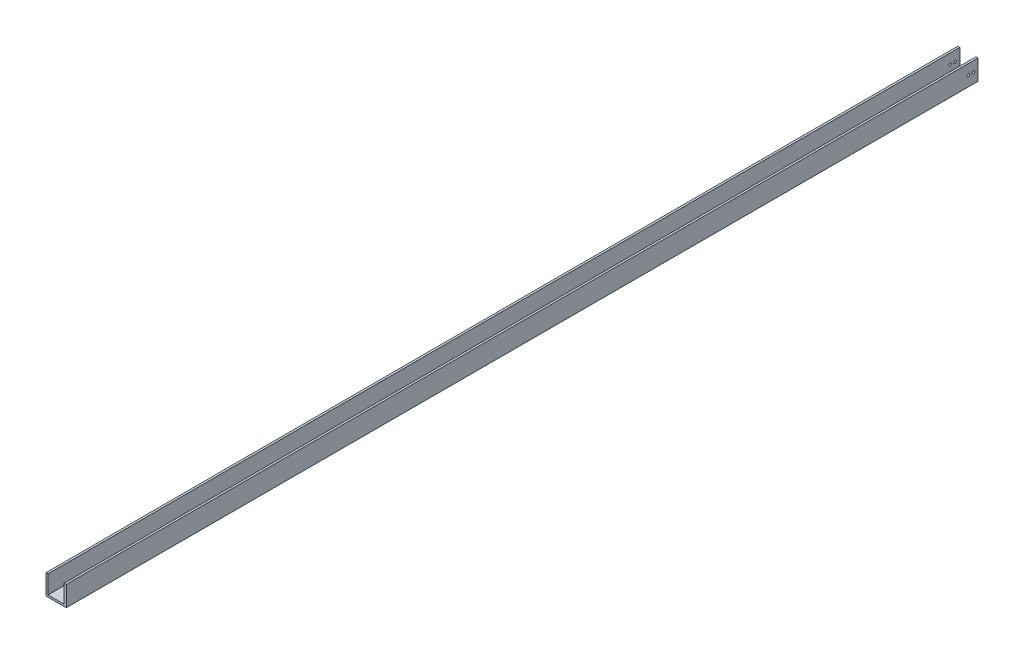
ISO-10303-21;
HEADER;
FILE_DESCRIPTION(('STEP AP214'),'2;1');
FILE_NAME('part.step','',(''),(''),'','','');
FILE_SCHEMA(('AUTOMOTIVE_DESIGN { 1 0 10303 214 1 1 1 1 }'));
ENDSEC;
DATA;
#1=APPLICATION_CONTEXT('core data for automotive mechanical design processes');
#2=APPLICATION_PROTOCOL_DEFINITION('international standard','automotive_design',2000,#1);
#3=PRODUCT_CONTEXT('',#1,'mechanical');
#4=PRODUCT('Part','Part','',(#3));
#5=PRODUCT_RELATED_PRODUCT_CATEGORY('part','',(#4));
#6=PRODUCT_DEFINITION_FORMATION('','',#4);
#7=PRODUCT_DEFINITION_CONTEXT('part definition',#1,'design');
#8=PRODUCT_DEFINITION('design','',#6,#7);
#9=PRODUCT_DEFINITION_SHAPE('','',#8);
#10=(LENGTH_UNIT() NAMED_UNIT(*) SI_UNIT(.MILLI.,.METRE.));
#11=(NAMED_UNIT(*) PLANE_ANGLE_UNIT() SI_UNIT($,.RADIAN.));
#12=(NAMED_UNIT(*) SI_UNIT($,.STERADIAN.) SOLID_ANGLE_UNIT());
#13=UNCERTAINTY_MEASURE_WITH_UNIT(LENGTH_MEASURE(1.E-05),#10,'distance_accuracy_value','');
#14=(GEOMETRIC_REPRESENTATION_CONTEXT(3) GLOBAL_UNCERTAINTY_ASSIGNED_CONTEXT((#13)) GLOBAL_UNIT_ASSIGNED_CONTEXT((#10,
#11,#12)) REPRESENTATION_CONTEXT('',''));
#15=CARTESIAN_POINT('',(0.,0.,0.));
#16=DIRECTION('',(0.,0.,1.));
#17=DIRECTION('',(1.,0.,0.));
#18=AXIS2_PLACEMENT_3D('',#15,#16,#17);
#19=CARTESIAN_POINT('',(0.,-40.,1800.));
#20=DIRECTION('',(1.,0.,0.));
#21=DIRECTION('',(0.,0.,-1.));
#22=AXIS2_PLACEMENT_3D('',#19,#20,#21);
#23=PLANE('',#22);
#24=CARTESIAN_POINT('',(0.,-20.,9.));
#25=DIRECTION('',(-1.,0.,0.));
#26=DIRECTION('',(0.,0.,1.));
#27=AXIS2_PLACEMENT_3D('',#24,#25,#26);
#28=CIRCLE('',#27,2.5);
#29=CARTESIAN_POINT('',(0.,-20.,11.5));
#30=VERTEX_POINT('',#29);
#31=EDGE_CURVE('E193',#30,#30,#28,.T.);
#32=ORIENTED_EDGE('',*,*,#31,.F.);
#33=EDGE_LOOP('',(#32));
#34=FACE_BOUND('',#33,.T.);
#35=CARTESIAN_POINT('',(0.,-20.,19.));
#36=DIRECTION('',(-1.,0.,0.));
#37=DIRECTION('',(0.,0.,1.));
#38=AXIS2_PLACEMENT_3D('',#35,#36,#37);
#39=CIRCLE('',#38,2.5);
#40=CARTESIAN_POINT('',(0.,-20.,21.5));
#41=VERTEX_POINT('',#40);
#42=EDGE_CURVE('E181',#41,#41,#39,.T.);
#43=ORIENTED_EDGE('',*,*,#42,.F.);
#44=EDGE_LOOP('',(#43));
#45=FACE_BOUND('',#44,.T.);
#46=DIRECTION('',(0.,-1.,0.));
#47=VECTOR('',#46,1.);
#48=CARTESIAN_POINT('',(0.,-40.,0.));
#49=LINE('',#48,#47);
#50=CARTESIAN_POINT('',(0.,0.,0.));
#51=VERTEX_POINT('',#50);
#52=CARTESIAN_POINT('',(0.,-40.,0.));
#53=VERTEX_POINT('',#52);
#54=EDGE_CURVE('E141',#51,#53,#49,.T.);
#55=ORIENTED_EDGE('',*,*,#54,.T.);
#56=DIRECTION('',(0.,0.,-1.));
#57=VECTOR('',#56,1.);
#58=CARTESIAN_POINT('',(0.,-40.,1800.));
#59=LINE('',#58,#57);
#60=CARTESIAN_POINT('',(0.,-40.,1800.));
#61=VERTEX_POINT('',#60);
#62=EDGE_CURVE('E11',#61,#53,#59,.T.);
#63=ORIENTED_EDGE('',*,*,#62,.F.);
#64=DIRECTION('',(0.,-1.,0.));
#65=VECTOR('',#64,1.);
#66=CARTESIAN_POINT('',(0.,-40.,1800.));
#67=LINE('',#66,#65);
#68=CARTESIAN_POINT('',(0.,0.,1800.));
#69=VERTEX_POINT('',#68);
#70=EDGE_CURVE('E156',#69,#61,#67,.T.);
#71=ORIENTED_EDGE('',*,*,#70,.F.);
#72=DIRECTION('',(0.,0.,-1.));
#73=VECTOR('',#72,1.);
#74=CARTESIAN_POINT('',(0.,0.,1800.));
#75=LINE('',#74,#73);
#76=EDGE_CURVE('E137',#69,#51,#75,.T.);
#77=ORIENTED_EDGE('',*,*,#76,.T.);
#78=EDGE_LOOP('',(#55,#63,#71,#77));
#79=FACE_BOUND('',#78,.T.);
#80=ADVANCED_FACE('F43',(#34,#45,#79),#23,.F.);
#81=CARTESIAN_POINT('',(40.,-40.,1800.));
#82=DIRECTION('',(0.,1.,0.));
#83=DIRECTION('',(-1.,0.,0.));
#84=AXIS2_PLACEMENT_3D('',#81,#82,#83);
#85=PLANE('',#84);
#86=CARTESIAN_POINT('',(20.,-40.,9.));
#87=DIRECTION('',(0.,-1.,0.));
#88=DIRECTION('',(1.,0.,0.));
#89=AXIS2_PLACEMENT_3D('',#86,#87,#88);
#90=CIRCLE('',#89,2.5);
#91=CARTESIAN_POINT('',(22.5,-40.,9.));
#92=VERTEX_POINT('',#91);
#93=EDGE_CURVE('E177',#92,#92,#90,.T.);
#94=ORIENTED_EDGE('',*,*,#93,.F.);
#95=EDGE_LOOP('',(#94));
#96=FACE_BOUND('',#95,.T.);
#97=CARTESIAN_POINT('',(20.,-40.,19.));
#98=DIRECTION('',(0.,-1.,0.));
#99=DIRECTION('',(1.,0.,0.));
#100=AXIS2_PLACEMENT_3D('',#97,#98,#99);
#101=CIRCLE('',#100,2.5);
#102=CARTESIAN_POINT('',(22.5,-40.,19.));
#103=VERTEX_POINT('',#102);
#104=EDGE_CURVE('E183',#103,#103,#101,.T.);
#105=ORIENTED_EDGE('',*,*,#104,.F.);
#106=EDGE_LOOP('',(#105));
#107=FACE_BOUND('',#106,.T.);
#108=DIRECTION('',(1.,0.,0.));
#109=VECTOR('',#108,1.);
#110=CARTESIAN_POINT('',(40.,-40.,0.));
#111=LINE('',#110,#109);
#112=CARTESIAN_POINT('',(40.,-40.,0.));
#113=VERTEX_POINT('',#112);
#114=EDGE_CURVE('E144',#53,#113,#111,.T.);
#115=ORIENTED_EDGE('',*,*,#114,.T.);
#116=DIRECTION('',(0.,0.,-1.));
#117=VECTOR('',#116,1.);
#118=CARTESIAN_POINT('',(40.,-40.,1800.));
#119=LINE('',#118,#117);
#120=CARTESIAN_POINT('',(40.,-40.,1800.));
#121=VERTEX_POINT('',#120);
#122=EDGE_CURVE('E52',#121,#113,#119,.T.);
#123=ORIENTED_EDGE('',*,*,#122,.F.);
#124=DIRECTION('',(1.,0.,0.));
#125=VECTOR('',#124,1.);
#126=CARTESIAN_POINT('',(40.,-40.,1800.));
#127=LINE('',#126,#125);
#128=EDGE_CURVE('E104',#61,#121,#127,.T.);
#129=ORIENTED_EDGE('',*,*,#128,.F.);
#130=ORIENTED_EDGE('',*,*,#62,.T.);
#131=EDGE_LOOP('',(#115,#123,#129,#130));
#132=FACE_BOUND('',#131,.T.);
#133=ADVANCED_FACE('F241',(#96,#107,#132),#85,.F.);
#134=CARTESIAN_POINT('',(40.,0.,1800.));
#135=DIRECTION('',(-1.,0.,0.));
#136=DIRECTION('',(0.,0.,1.));
#137=AXIS2_PLACEMENT_3D('',#134,#135,#136);
#138=PLANE('',#137);
#139=CARTESIAN_POINT('',(40.,-20.,9.));
#140=DIRECTION('',(-1.,0.,0.));
#141=DIRECTION('',(0.,0.,1.));
#142=AXIS2_PLACEMENT_3D('',#139,#140,#141);
#143=CIRCLE('',#142,2.5);
#144=CARTESIAN_POINT('',(40.,-20.,11.5));
#145=VERTEX_POINT('',#144);
#146=EDGE_CURVE('E172',#145,#145,#143,.T.);
#147=ORIENTED_EDGE('',*,*,#146,.T.);
#148=EDGE_LOOP('',(#147));
#149=FACE_BOUND('',#148,.T.);
#150=CARTESIAN_POINT('',(40.,-20.,19.));
#151=DIRECTION('',(-1.,0.,0.));
#152=DIRECTION('',(0.,0.,1.));
#153=AXIS2_PLACEMENT_3D('',#150,#151,#152);
#154=CIRCLE('',#153,2.5);
#155=CARTESIAN_POINT('',(40.,-20.,21.5));
#156=VERTEX_POINT('',#155);
#157=EDGE_CURVE('E196',#156,#156,#154,.T.);
#158=ORIENTED_EDGE('',*,*,#157,.T.);
#159=EDGE_LOOP('',(#158));
#160=FACE_BOUND('',#159,.T.);
#161=DIRECTION('',(0.,1.,0.));
#162=VECTOR('',#161,1.);
#163=CARTESIAN_POINT('',(40.,0.,0.));
#164=LINE('',#163,#162);
#165=CARTESIAN_POINT('',(40.,0.,0.));
#166=VERTEX_POINT('',#165);
#167=EDGE_CURVE('E147',#113,#166,#164,.T.);
#168=ORIENTED_EDGE('',*,*,#167,.T.);
#169=DIRECTION('',(0.,0.,-1.));
#170=VECTOR('',#169,1.);
#171=CARTESIAN_POINT('',(40.,0.,1800.));
#172=LINE('',#171,#170);
#173=CARTESIAN_POINT('',(40.,0.,1800.));
#174=VERTEX_POINT('',#173);
#175=EDGE_CURVE('E163',#174,#166,#172,.T.);
#176=ORIENTED_EDGE('',*,*,#175,.F.);
#177=DIRECTION('',(0.,1.,0.));
#178=VECTOR('',#177,1.);
#179=CARTESIAN_POINT('',(40.,0.,1800.));
#180=LINE('',#179,#178);
#181=EDGE_CURVE('E209',#121,#174,#180,.T.);
#182=ORIENTED_EDGE('',*,*,#181,.F.);
#183=ORIENTED_EDGE('',*,*,#122,.T.);
#184=EDGE_LOOP('',(#168,#176,#182,#183));
#185=FACE_BOUND('',#184,.T.);
#186=ADVANCED_FACE('F246',(#149,#160,#185),#138,.F.);
#187=CARTESIAN_POINT('',(36.,0.,1800.));
#188=DIRECTION('',(0.,-1.,0.));
#189=DIRECTION('',(0.,0.,-1.));
#190=AXIS2_PLACEMENT_3D('',#187,#188,#189);
#191=PLANE('',#190);
#192=DIRECTION('',(-1.,0.,0.));
#193=VECTOR('',#192,1.);
#194=CARTESIAN_POINT('',(36.,0.,0.));
#195=LINE('',#194,#193);
#196=CARTESIAN_POINT('',(36.,0.,0.));
#197=VERTEX_POINT('',#196);
#198=EDGE_CURVE('E149',#166,#197,#195,.T.);
#199=ORIENTED_EDGE('',*,*,#198,.T.);
#200=DIRECTION('',(0.,0.,-1.));
#201=VECTOR('',#200,1.);
#202=CARTESIAN_POINT('',(36.,0.,1800.));
#203=LINE('',#202,#201);
#204=CARTESIAN_POINT('',(36.,0.,1800.));
#205=VERTEX_POINT('',#204);
#206=EDGE_CURVE('E160',#205,#197,#203,.T.);
#207=ORIENTED_EDGE('',*,*,#206,.F.);
#208=DIRECTION('',(-1.,0.,0.));
#209=VECTOR('',#208,1.);
#210=CARTESIAN_POINT('',(36.,0.,1800.));
#211=LINE('',#210,#209);
#212=EDGE_CURVE('E211',#174,#205,#211,.T.);
#213=ORIENTED_EDGE('',*,*,#212,.F.);
#214=ORIENTED_EDGE('',*,*,#175,.T.);
#215=EDGE_LOOP('',(#199,#207,#213,#214));
#216=FACE_BOUND('',#215,.T.);
#217=ADVANCED_FACE('F217',(#216),#191,.F.);
#218=CARTESIAN_POINT('',(36.,-36.,1800.));
#219=DIRECTION('',(1.,0.,0.));
#220=DIRECTION('',(0.,0.,-1.));
#221=AXIS2_PLACEMENT_3D('',#218,#219,#220);
#222=PLANE('',#221);
#223=CARTESIAN_POINT('',(36.,-20.,9.));
#224=DIRECTION('',(1.,0.,0.));
#225=DIRECTION('',(0.,0.,-1.));
#226=AXIS2_PLACEMENT_3D('',#223,#224,#225);
#227=CIRCLE('',#226,2.5);
#228=CARTESIAN_POINT('',(36.,-20.,6.5));
#229=VERTEX_POINT('',#228);
#230=EDGE_CURVE('E145',#229,#229,#227,.T.);
#231=ORIENTED_EDGE('',*,*,#230,.T.);
#232=EDGE_LOOP('',(#231));
#233=FACE_BOUND('',#232,.T.);
#234=CARTESIAN_POINT('',(36.,-20.,19.));
#235=DIRECTION('',(1.,0.,0.));
#236=DIRECTION('',(0.,0.,-1.));
#237=AXIS2_PLACEMENT_3D('',#234,#235,#236);
#238=CIRCLE('',#237,2.5);
#239=CARTESIAN_POINT('',(36.,-20.,16.5));
#240=VERTEX_POINT('',#239);
#241=EDGE_CURVE('E171',#240,#240,#238,.T.);
#242=ORIENTED_EDGE('',*,*,#241,.T.);
#243=EDGE_LOOP('',(#242));
#244=FACE_BOUND('',#243,.T.);
#245=DIRECTION('',(0.,-1.,0.));
#246=VECTOR('',#245,1.);
#247=CARTESIAN_POINT('',(36.,-36.,0.));
#248=LINE('',#247,#246);
#249=CARTESIAN_POINT('',(36.,-36.,0.));
#250=VERTEX_POINT('',#249);
#251=EDGE_CURVE('E151',#197,#250,#248,.T.);
#252=ORIENTED_EDGE('',*,*,#251,.T.);
#253=DIRECTION('',(0.,0.,-1.));
#254=VECTOR('',#253,1.);
#255=CARTESIAN_POINT('',(36.,-36.,1800.));
#256=LINE('',#255,#254);
#257=CARTESIAN_POINT('',(36.,-36.,1800.));
#258=VERTEX_POINT('',#257);
#259=EDGE_CURVE('E132',#258,#250,#256,.T.);
#260=ORIENTED_EDGE('',*,*,#259,.F.);
#261=DIRECTION('',(0.,-1.,0.));
#262=VECTOR('',#261,1.);
#263=CARTESIAN_POINT('',(36.,-36.,1800.));
#264=LINE('',#263,#262);
#265=EDGE_CURVE('E123',#205,#258,#264,.T.);
#266=ORIENTED_EDGE('',*,*,#265,.F.);
#267=ORIENTED_EDGE('',*,*,#206,.T.);
#268=EDGE_LOOP('',(#252,#260,#266,#267));
#269=FACE_BOUND('',#268,.T.);
#270=ADVANCED_FACE('F221',(#233,#244,#269),#222,.F.);
#271=CARTESIAN_POINT('',(4.,-36.,1800.));
#272=DIRECTION('',(0.,-1.,0.));
#273=DIRECTION('',(0.,0.,-1.));
#274=AXIS2_PLACEMENT_3D('',#271,#272,#273);
#275=PLANE('',#274);
#276=CARTESIAN_POINT('',(20.,-36.,9.));
#277=DIRECTION('',(0.,-1.,0.));
#278=DIRECTION('',(0.,0.,-1.));
#279=AXIS2_PLACEMENT_3D('',#276,#277,#278);
#280=CIRCLE('',#279,2.5);
#281=CARTESIAN_POINT('',(20.,-36.,6.5));
#282=VERTEX_POINT('',#281);
#283=EDGE_CURVE('E46',#282,#282,#280,.T.);
#284=ORIENTED_EDGE('',*,*,#283,.T.);
#285=EDGE_LOOP('',(#284));
#286=FACE_BOUND('',#285,.T.);
#287=CARTESIAN_POINT('',(20.,-36.,19.));
#288=DIRECTION('',(0.,-1.,0.));
#289=DIRECTION('',(0.,0.,-1.));
#290=AXIS2_PLACEMENT_3D('',#287,#288,#289);
#291=CIRCLE('',#290,2.5);
#292=CARTESIAN_POINT('',(20.,-36.,16.5));
#293=VERTEX_POINT('',#292);
#294=EDGE_CURVE('E175',#293,#293,#291,.T.);
#295=ORIENTED_EDGE('',*,*,#294,.T.);
#296=EDGE_LOOP('',(#295));
#297=FACE_BOUND('',#296,.T.);
#298=DIRECTION('',(-1.,0.,0.));
#299=VECTOR('',#298,1.);
#300=CARTESIAN_POINT('',(4.,-36.,0.));
#301=LINE('',#300,#299);
#302=CARTESIAN_POINT('',(4.,-36.,0.));
#303=VERTEX_POINT('',#302);
#304=EDGE_CURVE('E131',#250,#303,#301,.T.);
#305=ORIENTED_EDGE('',*,*,#304,.T.);
#306=DIRECTION('',(0.,0.,-1.));
#307=VECTOR('',#306,1.);
#308=CARTESIAN_POINT('',(4.,-36.,1800.));
#309=LINE('',#308,#307);
#310=CARTESIAN_POINT('',(4.,-36.,1800.));
#311=VERTEX_POINT('',#310);
#312=EDGE_CURVE('E128',#311,#303,#309,.T.);
#313=ORIENTED_EDGE('',*,*,#312,.F.);
#314=DIRECTION('',(-1.,0.,0.));
#315=VECTOR('',#314,1.);
#316=CARTESIAN_POINT('',(4.,-36.,1800.));
#317=LINE('',#316,#315);
#318=EDGE_CURVE('E117',#258,#311,#317,.T.);
#319=ORIENTED_EDGE('',*,*,#318,.F.);
#320=ORIENTED_EDGE('',*,*,#259,.T.);
#321=EDGE_LOOP('',(#305,#313,#319,#320));
#322=FACE_BOUND('',#321,.T.);
#323=ADVANCED_FACE('F129',(#286,#297,#322),#275,.F.);
#324=CARTESIAN_POINT('',(4.,0.,1800.));
#325=DIRECTION('',(-1.,0.,0.));
#326=DIRECTION('',(0.,-1.,0.));
#327=AXIS2_PLACEMENT_3D('',#324,#325,#326);
#328=PLANE('',#327);
#329=CARTESIAN_POINT('',(4.,-20.,9.));
#330=DIRECTION('',(-1.,0.,0.));
#331=DIRECTION('',(0.,-1.,0.));
#332=AXIS2_PLACEMENT_3D('',#329,#330,#331);
#333=CIRCLE('',#332,2.5);
#334=CARTESIAN_POINT('',(4.,-22.5,9.));
#335=VERTEX_POINT('',#334);
#336=EDGE_CURVE('E173',#335,#335,#333,.T.);
#337=ORIENTED_EDGE('',*,*,#336,.T.);
#338=EDGE_LOOP('',(#337));
#339=FACE_BOUND('',#338,.T.);
#340=CARTESIAN_POINT('',(4.,-20.,19.));
#341=DIRECTION('',(-1.,0.,0.));
#342=DIRECTION('',(0.,-1.,0.));
#343=AXIS2_PLACEMENT_3D('',#340,#341,#342);
#344=CIRCLE('',#343,2.5);
#345=CARTESIAN_POINT('',(4.,-22.5,19.));
#346=VERTEX_POINT('',#345);
#347=EDGE_CURVE('E168',#346,#346,#344,.T.);
#348=ORIENTED_EDGE('',*,*,#347,.T.);
#349=EDGE_LOOP('',(#348));
#350=FACE_BOUND('',#349,.T.);
#351=DIRECTION('',(0.,1.,0.));
#352=VECTOR('',#351,1.);
#353=CARTESIAN_POINT('',(4.,0.,0.));
#354=LINE('',#353,#352);
#355=CARTESIAN_POINT('',(4.,0.,0.));
#356=VERTEX_POINT('',#355);
#357=EDGE_CURVE('E90',#303,#356,#354,.T.);
#358=ORIENTED_EDGE('',*,*,#357,.T.);
#359=DIRECTION('',(0.,0.,-1.));
#360=VECTOR('',#359,1.);
#361=CARTESIAN_POINT('',(4.,0.,1800.));
#362=LINE('',#361,#360);
#363=CARTESIAN_POINT('',(4.,0.,1800.));
#364=VERTEX_POINT('',#363);
#365=EDGE_CURVE('E133',#364,#356,#362,.T.);
#366=ORIENTED_EDGE('',*,*,#365,.F.);
#367=DIRECTION('',(0.,1.,0.));
#368=VECTOR('',#367,1.);
#369=CARTESIAN_POINT('',(4.,0.,1800.));
#370=LINE('',#369,#368);
#371=EDGE_CURVE('E121',#311,#364,#370,.T.);
#372=ORIENTED_EDGE('',*,*,#371,.F.);
#373=ORIENTED_EDGE('',*,*,#312,.T.);
#374=EDGE_LOOP('',(#358,#366,#372,#373));
#375=FACE_BOUND('',#374,.T.);
#376=ADVANCED_FACE('F135',(#339,#350,#375),#328,.F.);
#377=CARTESIAN_POINT('',(0.,0.,1800.));
#378=DIRECTION('',(0.,-1.,0.));
#379=DIRECTION('',(0.,0.,-1.));
#380=AXIS2_PLACEMENT_3D('',#377,#378,#379);
#381=PLANE('',#380);
#382=DIRECTION('',(-1.,0.,0.));
#383=VECTOR('',#382,1.);
#384=CARTESIAN_POINT('',(0.,0.,0.));
#385=LINE('',#384,#383);
#386=EDGE_CURVE('E96',#356,#51,#385,.T.);
#387=ORIENTED_EDGE('',*,*,#386,.T.);
#388=ORIENTED_EDGE('',*,*,#76,.F.);
#389=DIRECTION('',(-1.,0.,0.));
#390=VECTOR('',#389,1.);
#391=CARTESIAN_POINT('',(0.,0.,1800.));
#392=LINE('',#391,#390);
#393=EDGE_CURVE('E61',#364,#69,#392,.T.);
#394=ORIENTED_EDGE('',*,*,#393,.F.);
#395=ORIENTED_EDGE('',*,*,#365,.T.);
#396=EDGE_LOOP('',(#387,#388,#394,#395));
#397=FACE_BOUND('',#396,.T.);
#398=ADVANCED_FACE('F229',(#397),#381,.F.);
#399=CARTESIAN_POINT('',(0.,0.,1800.));
#400=DIRECTION('',(0.,0.,-1.));
#401=DIRECTION('',(-1.,0.,0.));
#402=AXIS2_PLACEMENT_3D('',#399,#400,#401);
#403=PLANE('',#402);
#404=ORIENTED_EDGE('',*,*,#70,.T.);
#405=ORIENTED_EDGE('',*,*,#128,.T.);
#406=ORIENTED_EDGE('',*,*,#181,.T.);
#407=ORIENTED_EDGE('',*,*,#212,.T.);
#408=ORIENTED_EDGE('',*,*,#265,.T.);
#409=ORIENTED_EDGE('',*,*,#318,.T.);
#410=ORIENTED_EDGE('',*,*,#371,.T.);
#411=ORIENTED_EDGE('',*,*,#393,.T.);
#412=EDGE_LOOP('',(#404,#405,#406,#407,#408,#409,#410,#411));
#413=FACE_BOUND('',#412,.T.);
#414=ADVANCED_FACE('F119',(#413),#403,.F.);
#415=CARTESIAN_POINT('',(0.,0.,0.));
#416=DIRECTION('',(0.,0.,-1.));
#417=DIRECTION('',(-1.,0.,0.));
#418=AXIS2_PLACEMENT_3D('',#415,#416,#417);
#419=PLANE('',#418);
#420=ORIENTED_EDGE('',*,*,#54,.F.);
#421=ORIENTED_EDGE('',*,*,#386,.F.);
#422=ORIENTED_EDGE('',*,*,#357,.F.);
#423=ORIENTED_EDGE('',*,*,#304,.F.);
#424=ORIENTED_EDGE('',*,*,#251,.F.);
#425=ORIENTED_EDGE('',*,*,#198,.F.);
#426=ORIENTED_EDGE('',*,*,#167,.F.);
#427=ORIENTED_EDGE('',*,*,#114,.F.);
#428=EDGE_LOOP('',(#420,#421,#422,#423,#424,#425,#426,#427));
#429=FACE_BOUND('',#428,.T.);
#430=ADVANCED_FACE('F224',(#429),#419,.T.);
#431=CARTESIAN_POINT('',(40.,-20.,19.));
#432=DIRECTION('',(-1.,0.,0.));
#433=DIRECTION('',(0.,0.,1.));
#434=AXIS2_PLACEMENT_3D('',#431,#432,#433);
#435=CYLINDRICAL_SURFACE('',#434,2.5);
#436=ORIENTED_EDGE('',*,*,#42,.T.);
#437=EDGE_LOOP('',(#436));
#438=FACE_BOUND('',#437,.T.);
#439=ORIENTED_EDGE('',*,*,#347,.F.);
#440=EDGE_LOOP('',(#439));
#441=FACE_BOUND('',#440,.T.);
#442=ADVANCED_FACE('F252',(#438,#441),#435,.F.);
#443=CARTESIAN_POINT('',(40.,-20.,9.));
#444=DIRECTION('',(-1.,0.,0.));
#445=DIRECTION('',(0.,0.,1.));
#446=AXIS2_PLACEMENT_3D('',#443,#444,#445);
#447=CYLINDRICAL_SURFACE('',#446,2.5);
#448=ORIENTED_EDGE('',*,*,#31,.T.);
#449=EDGE_LOOP('',(#448));
#450=FACE_BOUND('',#449,.T.);
#451=ORIENTED_EDGE('',*,*,#336,.F.);
#452=EDGE_LOOP('',(#451));
#453=FACE_BOUND('',#452,.T.);
#454=ADVANCED_FACE('F255',(#450,#453),#447,.F.);
#455=ORIENTED_EDGE('',*,*,#157,.F.);
#456=EDGE_LOOP('',(#455));
#457=FACE_BOUND('',#456,.T.);
#458=ORIENTED_EDGE('',*,*,#241,.F.);
#459=EDGE_LOOP('',(#458));
#460=FACE_BOUND('',#459,.T.);
#461=ADVANCED_FACE('F257',(#457,#460),#435,.F.);
#462=ORIENTED_EDGE('',*,*,#146,.F.);
#463=EDGE_LOOP('',(#462));
#464=FACE_BOUND('',#463,.T.);
#465=ORIENTED_EDGE('',*,*,#230,.F.);
#466=EDGE_LOOP('',(#465));
#467=FACE_BOUND('',#466,.T.);
#468=ADVANCED_FACE('F266',(#464,#467),#447,.F.);
#469=CARTESIAN_POINT('',(20.,-30.,19.));
#470=DIRECTION('',(0.,-1.,0.));
#471=DIRECTION('',(1.,0.,0.));
#472=AXIS2_PLACEMENT_3D('',#469,#470,#471);
#473=CYLINDRICAL_SURFACE('',#472,2.5);
#474=ORIENTED_EDGE('',*,*,#104,.T.);
#475=EDGE_LOOP('',(#474));
#476=FACE_BOUND('',#475,.T.);
#477=ORIENTED_EDGE('',*,*,#294,.F.);
#478=EDGE_LOOP('',(#477));
#479=FACE_BOUND('',#478,.T.);
#480=ADVANCED_FACE('F272',(#476,#479),#473,.F.);
#481=CARTESIAN_POINT('',(20.,-30.,9.));
#482=DIRECTION('',(0.,-1.,0.));
#483=DIRECTION('',(1.,0.,0.));
#484=AXIS2_PLACEMENT_3D('',#481,#482,#483);
#485=CYLINDRICAL_SURFACE('',#484,2.5);
#486=ORIENTED_EDGE('',*,*,#93,.T.);
#487=EDGE_LOOP('',(#486));
#488=FACE_BOUND('',#487,.T.);
#489=ORIENTED_EDGE('',*,*,#283,.F.);
#490=EDGE_LOOP('',(#489));
#491=FACE_BOUND('',#490,.T.);
#492=ADVANCED_FACE('F341',(#488,#491),#485,.F.);
#493=CLOSED_SHELL('',(#80,#133,#186,#217,#270,#323,#376,#398,#414,#430,#442,#454,#461,#468,#480,#492));
#494=MANIFOLD_SOLID_BREP('B2',#493);
#495=ADVANCED_BREP_SHAPE_REPRESENTATION('',(#18,#494),#14);
#496=SHAPE_DEFINITION_REPRESENTATION(#9,#495);
ENDSEC;
END-ISO-10303-21;
